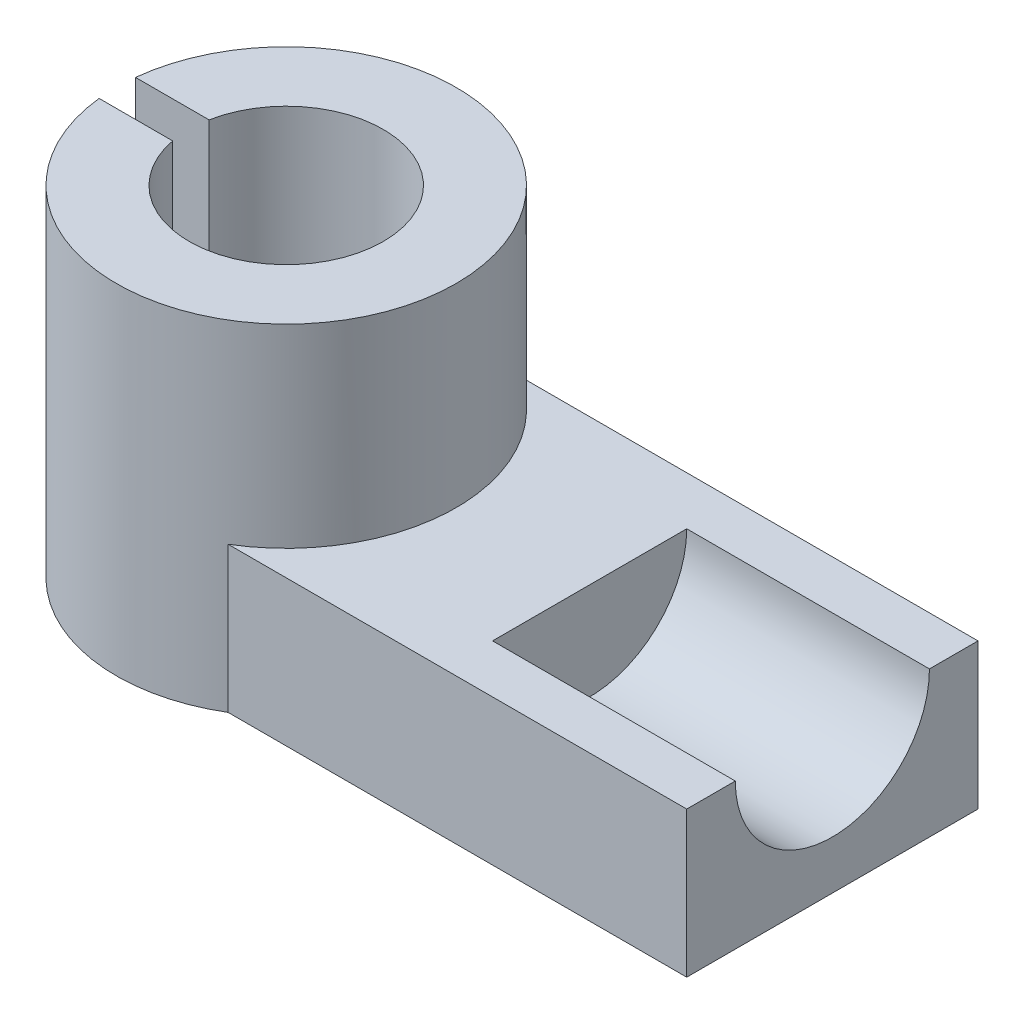
ISO-10303-21;
HEADER;
FILE_DESCRIPTION(('STEP AP214'),'2;1');
FILE_NAME('part.step','',(''),(''),'','','');
FILE_SCHEMA(('AUTOMOTIVE_DESIGN { 1 0 10303 214 1 1 1 1 }'));
ENDSEC;
DATA;
#1=APPLICATION_CONTEXT('core data for automotive mechanical design processes');
#2=APPLICATION_PROTOCOL_DEFINITION('international standard','automotive_design',2000,#1);
#3=PRODUCT_CONTEXT('',#1,'mechanical');
#4=PRODUCT('Part','Part','',(#3));
#5=PRODUCT_RELATED_PRODUCT_CATEGORY('part','',(#4));
#6=PRODUCT_DEFINITION_FORMATION('','',#4);
#7=PRODUCT_DEFINITION_CONTEXT('part definition',#1,'design');
#8=PRODUCT_DEFINITION('design','',#6,#7);
#9=PRODUCT_DEFINITION_SHAPE('','',#8);
#10=(LENGTH_UNIT() NAMED_UNIT(*) SI_UNIT(.MILLI.,.METRE.));
#11=(NAMED_UNIT(*) PLANE_ANGLE_UNIT() SI_UNIT($,.RADIAN.));
#12=(NAMED_UNIT(*) SI_UNIT($,.STERADIAN.) SOLID_ANGLE_UNIT());
#13=UNCERTAINTY_MEASURE_WITH_UNIT(LENGTH_MEASURE(1.E-05),#10,'distance_accuracy_value','');
#14=(GEOMETRIC_REPRESENTATION_CONTEXT(3) GLOBAL_UNCERTAINTY_ASSIGNED_CONTEXT((#13)) GLOBAL_UNIT_ASSIGNED_CONTEXT((#10,
#11,#12)) REPRESENTATION_CONTEXT('',''));
#15=CARTESIAN_POINT('',(0.,0.,0.));
#16=DIRECTION('',(0.,0.,1.));
#17=DIRECTION('',(1.,0.,0.));
#18=AXIS2_PLACEMENT_3D('',#15,#16,#17);
#19=CARTESIAN_POINT('',(0.,0.,0.));
#20=DIRECTION('',(0.,-1.,0.));
#21=DIRECTION('',(0.,0.,-1.));
#22=AXIS2_PLACEMENT_3D('',#19,#20,#21);
#23=PLANE('',#22);
#24=CARTESIAN_POINT('',(0.,0.,0.));
#25=DIRECTION('',(0.,1.,0.));
#26=DIRECTION('',(0.,0.,-1.));
#27=AXIS2_PLACEMENT_3D('',#24,#25,#26);
#28=CIRCLE('',#27,71.12);
#29=CARTESIAN_POINT('',(-70.7106074079413,0.,7.61999999999999));
#30=VERTEX_POINT('',#29);
#31=CARTESIAN_POINT('',(36.6324009587141,0.,60.96));
#32=VERTEX_POINT('',#31);
#33=EDGE_CURVE('E180',#30,#32,#28,.T.);
#34=ORIENTED_EDGE('',*,*,#33,.F.);
#35=DIRECTION('',(1.,0.,0.));
#36=VECTOR('',#35,1.);
#37=CARTESIAN_POINT('',(-39.9192334595744,0.,7.62));
#38=LINE('',#37,#36);
#39=CARTESIAN_POINT('',(-39.9192334595744,0.,7.62));
#40=VERTEX_POINT('',#39);
#41=EDGE_CURVE('E130',#30,#40,#38,.T.);
#42=ORIENTED_EDGE('',*,*,#41,.T.);
#43=CARTESIAN_POINT('',(0.,0.,0.));
#44=DIRECTION('',(0.,1.,0.));
#45=DIRECTION('',(0.,0.,-1.));
#46=AXIS2_PLACEMENT_3D('',#43,#44,#45);
#47=CIRCLE('',#46,40.64);
#48=CARTESIAN_POINT('',(-39.9192334595744,0.,-7.61999999999999));
#49=VERTEX_POINT('',#48);
#50=EDGE_CURVE('E117',#40,#49,#47,.T.);
#51=ORIENTED_EDGE('',*,*,#50,.T.);
#52=DIRECTION('',(-1.,0.,0.));
#53=VECTOR('',#52,1.);
#54=CARTESIAN_POINT('',(-39.9192334595744,0.,-7.61999999999999));
#55=LINE('',#54,#53);
#56=CARTESIAN_POINT('',(-70.7106074079413,0.,-7.61999999999995));
#57=VERTEX_POINT('',#56);
#58=EDGE_CURVE('E128',#49,#57,#55,.T.);
#59=ORIENTED_EDGE('',*,*,#58,.T.);
#60=CARTESIAN_POINT('',(36.632400958714,0.,-60.96));
#61=VERTEX_POINT('',#60);
#62=EDGE_CURVE('E176',#61,#57,#28,.T.);
#63=ORIENTED_EDGE('',*,*,#62,.F.);
#64=DIRECTION('',(-1.,0.,0.));
#65=VECTOR('',#64,1.);
#66=CARTESIAN_POINT('',(228.6,0.,-60.96));
#67=LINE('',#66,#65);
#68=CARTESIAN_POINT('',(228.6,0.,-60.96));
#69=VERTEX_POINT('',#68);
#70=EDGE_CURVE('E163',#69,#61,#67,.T.);
#71=ORIENTED_EDGE('',*,*,#70,.F.);
#72=DIRECTION('',(0.,0.,-1.));
#73=VECTOR('',#72,1.);
#74=CARTESIAN_POINT('',(228.6,0.,-60.96));
#75=LINE('',#74,#73);
#76=CARTESIAN_POINT('',(228.6,0.,60.96));
#77=VERTEX_POINT('',#76);
#78=EDGE_CURVE('E168',#77,#69,#75,.T.);
#79=ORIENTED_EDGE('',*,*,#78,.F.);
#80=DIRECTION('',(1.,0.,0.));
#81=VECTOR('',#80,1.);
#82=CARTESIAN_POINT('',(228.6,0.,60.96));
#83=LINE('',#82,#81);
#84=EDGE_CURVE('E185',#32,#77,#83,.T.);
#85=ORIENTED_EDGE('',*,*,#84,.F.);
#86=EDGE_LOOP('',(#34,#42,#51,#59,#63,#71,#79,#85));
#87=FACE_BOUND('',#86,.T.);
#88=ADVANCED_FACE('F39',(#87),#23,.T.);
#89=CARTESIAN_POINT('',(228.6,60.96,-60.96));
#90=DIRECTION('',(-1.,0.,0.));
#91=DIRECTION('',(0.,0.,1.));
#92=AXIS2_PLACEMENT_3D('',#89,#90,#91);
#93=PLANE('',#92);
#94=DIRECTION('',(0.,0.,-1.));
#95=VECTOR('',#94,1.);
#96=CARTESIAN_POINT('',(228.6,60.96,-60.96));
#97=LINE('',#96,#95);
#98=CARTESIAN_POINT('',(228.6,60.96,-40.64));
#99=VERTEX_POINT('',#98);
#100=CARTESIAN_POINT('',(228.6,60.96,-60.96));
#101=VERTEX_POINT('',#100);
#102=EDGE_CURVE('E171',#99,#101,#97,.T.);
#103=ORIENTED_EDGE('',*,*,#102,.F.);
#104=CARTESIAN_POINT('',(228.6,60.96,0.));
#105=DIRECTION('',(1.,0.,0.));
#106=DIRECTION('',(0.,0.,-1.));
#107=AXIS2_PLACEMENT_3D('',#104,#105,#106);
#108=CIRCLE('',#107,40.64);
#109=CARTESIAN_POINT('',(228.6,60.96,40.64));
#110=VERTEX_POINT('',#109);
#111=EDGE_CURVE('E148',#99,#110,#108,.F.);
#112=ORIENTED_EDGE('',*,*,#111,.T.);
#113=CARTESIAN_POINT('',(228.6,60.96,60.96));
#114=VERTEX_POINT('',#113);
#115=EDGE_CURVE('E175',#114,#110,#97,.T.);
#116=ORIENTED_EDGE('',*,*,#115,.F.);
#117=DIRECTION('',(0.,-1.,0.));
#118=VECTOR('',#117,1.);
#119=CARTESIAN_POINT('',(228.6,60.96,60.96));
#120=LINE('',#119,#118);
#121=EDGE_CURVE('E186',#114,#77,#120,.T.);
#122=ORIENTED_EDGE('',*,*,#121,.T.);
#123=ORIENTED_EDGE('',*,*,#78,.T.);
#124=DIRECTION('',(0.,-1.,0.));
#125=VECTOR('',#124,1.);
#126=CARTESIAN_POINT('',(228.6,60.96,-60.96));
#127=LINE('',#126,#125);
#128=EDGE_CURVE('E178',#101,#69,#127,.T.);
#129=ORIENTED_EDGE('',*,*,#128,.F.);
#130=EDGE_LOOP('',(#103,#112,#116,#122,#123,#129));
#131=FACE_BOUND('',#130,.T.);
#132=ADVANCED_FACE('F205',(#131),#93,.F.);
#133=CARTESIAN_POINT('',(0.,60.96,0.));
#134=DIRECTION('',(0.,-1.,0.));
#135=DIRECTION('',(0.,0.,-1.));
#136=AXIS2_PLACEMENT_3D('',#133,#134,#135);
#137=PLANE('',#136);
#138=DIRECTION('',(0.,0.,1.));
#139=VECTOR('',#138,1.);
#140=CARTESIAN_POINT('',(127.,60.96,0.));
#141=LINE('',#140,#139);
#142=CARTESIAN_POINT('',(127.,60.96,-40.64));
#143=VERTEX_POINT('',#142);
#144=CARTESIAN_POINT('',(127.,60.96,40.64));
#145=VERTEX_POINT('',#144);
#146=EDGE_CURVE('E151',#143,#145,#141,.T.);
#147=ORIENTED_EDGE('',*,*,#146,.F.);
#148=DIRECTION('',(1.,0.,0.));
#149=VECTOR('',#148,1.);
#150=CARTESIAN_POINT('',(127.,60.96,-40.64));
#151=LINE('',#150,#149);
#152=EDGE_CURVE('E153',#143,#99,#151,.T.);
#153=ORIENTED_EDGE('',*,*,#152,.T.);
#154=ORIENTED_EDGE('',*,*,#102,.T.);
#155=DIRECTION('',(-1.,0.,0.));
#156=VECTOR('',#155,1.);
#157=CARTESIAN_POINT('',(228.6,60.96,-60.96));
#158=LINE('',#157,#156);
#159=CARTESIAN_POINT('',(36.632400958714,60.96,-60.96));
#160=VERTEX_POINT('',#159);
#161=EDGE_CURVE('E170',#101,#160,#158,.T.);
#162=ORIENTED_EDGE('',*,*,#161,.T.);
#163=CARTESIAN_POINT('',(0.,60.96,0.));
#164=DIRECTION('',(0.,1.,0.));
#165=DIRECTION('',(0.,0.,1.));
#166=AXIS2_PLACEMENT_3D('',#163,#164,#165);
#167=CIRCLE('',#166,71.12);
#168=CARTESIAN_POINT('',(36.6324009587141,60.96,60.96));
#169=VERTEX_POINT('',#168);
#170=EDGE_CURVE('E158',#169,#160,#167,.T.);
#171=ORIENTED_EDGE('',*,*,#170,.F.);
#172=DIRECTION('',(1.,0.,0.));
#173=VECTOR('',#172,1.);
#174=CARTESIAN_POINT('',(228.6,60.96,60.96));
#175=LINE('',#174,#173);
#176=EDGE_CURVE('E166',#169,#114,#175,.T.);
#177=ORIENTED_EDGE('',*,*,#176,.T.);
#178=ORIENTED_EDGE('',*,*,#115,.T.);
#179=DIRECTION('',(1.,0.,0.));
#180=VECTOR('',#179,1.);
#181=CARTESIAN_POINT('',(127.,60.96,40.64));
#182=LINE('',#181,#180);
#183=EDGE_CURVE('E156',#145,#110,#182,.T.);
#184=ORIENTED_EDGE('',*,*,#183,.F.);
#185=EDGE_LOOP('',(#147,#153,#154,#162,#171,#177,#178,#184));
#186=FACE_BOUND('',#185,.T.);
#187=ADVANCED_FACE('F207',(#186),#137,.F.);
#188=CARTESIAN_POINT('',(228.6,60.96,-60.96));
#189=DIRECTION('',(0.,0.,1.));
#190=DIRECTION('',(1.,0.,0.));
#191=AXIS2_PLACEMENT_3D('',#188,#189,#190);
#192=PLANE('',#191);
#193=ORIENTED_EDGE('',*,*,#70,.T.);
#194=DIRECTION('',(0.,-1.,0.));
#195=VECTOR('',#194,1.);
#196=CARTESIAN_POINT('',(36.632400958714,60.96,-60.96));
#197=LINE('',#196,#195);
#198=EDGE_CURVE('E11',#160,#61,#197,.T.);
#199=ORIENTED_EDGE('',*,*,#198,.F.);
#200=ORIENTED_EDGE('',*,*,#161,.F.);
#201=ORIENTED_EDGE('',*,*,#128,.T.);
#202=EDGE_LOOP('',(#193,#199,#200,#201));
#203=FACE_BOUND('',#202,.T.);
#204=ADVANCED_FACE('F41',(#203),#192,.F.);
#205=CARTESIAN_POINT('',(0.,60.96,0.));
#206=DIRECTION('',(0.,-1.,0.));
#207=DIRECTION('',(0.,0.,-1.));
#208=AXIS2_PLACEMENT_3D('',#205,#206,#207);
#209=CYLINDRICAL_SURFACE('',#208,71.12);
#210=ORIENTED_EDGE('',*,*,#62,.T.);
#211=DIRECTION('',(0.,1.,0.));
#212=VECTOR('',#211,1.);
#213=CARTESIAN_POINT('',(-70.7106074079413,0.,-7.61999999999995));
#214=LINE('',#213,#212);
#215=CARTESIAN_POINT('',(-70.7106074079413,142.24,-7.61999999999995));
#216=VERTEX_POINT('',#215);
#217=EDGE_CURVE('E127',#57,#216,#214,.T.);
#218=ORIENTED_EDGE('',*,*,#217,.T.);
#219=CARTESIAN_POINT('',(0.,142.24,0.));
#220=DIRECTION('',(0.,1.,0.));
#221=DIRECTION('',(0.,0.,1.));
#222=AXIS2_PLACEMENT_3D('',#219,#220,#221);
#223=CIRCLE('',#222,71.12);
#224=CARTESIAN_POINT('',(-70.7106074079413,142.24,7.61999999999999));
#225=VERTEX_POINT('',#224);
#226=EDGE_CURVE('E161',#225,#216,#223,.T.);
#227=ORIENTED_EDGE('',*,*,#226,.F.);
#228=DIRECTION('',(0.,1.,0.));
#229=VECTOR('',#228,1.);
#230=CARTESIAN_POINT('',(-70.7106074079413,0.,7.61999999999999));
#231=LINE('',#230,#229);
#232=EDGE_CURVE('E150',#30,#225,#231,.T.);
#233=ORIENTED_EDGE('',*,*,#232,.F.);
#234=ORIENTED_EDGE('',*,*,#33,.T.);
#235=DIRECTION('',(0.,-1.,0.));
#236=VECTOR('',#235,1.);
#237=CARTESIAN_POINT('',(36.6324009587141,60.96,60.96));
#238=LINE('',#237,#236);
#239=EDGE_CURVE('E50',#169,#32,#238,.T.);
#240=ORIENTED_EDGE('',*,*,#239,.F.);
#241=ORIENTED_EDGE('',*,*,#170,.T.);
#242=ORIENTED_EDGE('',*,*,#198,.T.);
#243=EDGE_LOOP('',(#210,#218,#227,#233,#234,#240,#241,#242));
#244=FACE_BOUND('',#243,.T.);
#245=ADVANCED_FACE('F231',(#244),#209,.T.);
#246=CARTESIAN_POINT('',(228.6,60.96,60.96));
#247=DIRECTION('',(0.,0.,-1.));
#248=DIRECTION('',(-1.,0.,0.));
#249=AXIS2_PLACEMENT_3D('',#246,#247,#248);
#250=PLANE('',#249);
#251=ORIENTED_EDGE('',*,*,#84,.T.);
#252=ORIENTED_EDGE('',*,*,#121,.F.);
#253=ORIENTED_EDGE('',*,*,#176,.F.);
#254=ORIENTED_EDGE('',*,*,#239,.T.);
#255=EDGE_LOOP('',(#251,#252,#253,#254));
#256=FACE_BOUND('',#255,.T.);
#257=ADVANCED_FACE('F192',(#256),#250,.F.);
#258=CARTESIAN_POINT('',(0.,142.24,0.));
#259=DIRECTION('',(0.,1.,0.));
#260=DIRECTION('',(0.,0.,1.));
#261=AXIS2_PLACEMENT_3D('',#258,#259,#260);
#262=PLANE('',#261);
#263=DIRECTION('',(-1.,0.,0.));
#264=VECTOR('',#263,1.);
#265=CARTESIAN_POINT('',(-39.9192334595744,142.24,-7.61999999999999));
#266=LINE('',#265,#264);
#267=CARTESIAN_POINT('',(-39.9192334595744,142.24,-7.61999999999999));
#268=VERTEX_POINT('',#267);
#269=EDGE_CURVE('E137',#268,#216,#266,.T.);
#270=ORIENTED_EDGE('',*,*,#269,.F.);
#271=CARTESIAN_POINT('',(0.,142.24,0.));
#272=DIRECTION('',(0.,1.,0.));
#273=DIRECTION('',(0.,0.,-1.));
#274=AXIS2_PLACEMENT_3D('',#271,#272,#273);
#275=CIRCLE('',#274,40.64);
#276=CARTESIAN_POINT('',(-39.9192334595744,142.24,7.62));
#277=VERTEX_POINT('',#276);
#278=EDGE_CURVE('E122',#277,#268,#275,.T.);
#279=ORIENTED_EDGE('',*,*,#278,.F.);
#280=DIRECTION('',(1.,0.,0.));
#281=VECTOR('',#280,1.);
#282=CARTESIAN_POINT('',(-39.9192334595744,142.24,7.62));
#283=LINE('',#282,#281);
#284=EDGE_CURVE('E53',#225,#277,#283,.T.);
#285=ORIENTED_EDGE('',*,*,#284,.F.);
#286=ORIENTED_EDGE('',*,*,#226,.T.);
#287=EDGE_LOOP('',(#270,#279,#285,#286));
#288=FACE_BOUND('',#287,.T.);
#289=ADVANCED_FACE('F224',(#288),#262,.T.);
#290=CARTESIAN_POINT('',(127.,60.96,0.));
#291=DIRECTION('',(1.,0.,0.));
#292=DIRECTION('',(0.,0.,-1.));
#293=AXIS2_PLACEMENT_3D('',#290,#291,#292);
#294=CYLINDRICAL_SURFACE('',#293,40.64);
#295=ORIENTED_EDGE('',*,*,#111,.F.);
#296=ORIENTED_EDGE('',*,*,#152,.F.);
#297=CARTESIAN_POINT('',(127.,60.96,0.));
#298=DIRECTION('',(1.,0.,0.));
#299=DIRECTION('',(0.,0.,-1.));
#300=AXIS2_PLACEMENT_3D('',#297,#298,#299);
#301=CIRCLE('',#300,40.64);
#302=EDGE_CURVE('E64',#143,#145,#301,.F.);
#303=ORIENTED_EDGE('',*,*,#302,.T.);
#304=ORIENTED_EDGE('',*,*,#183,.T.);
#305=EDGE_LOOP('',(#295,#296,#303,#304));
#306=FACE_BOUND('',#305,.T.);
#307=ADVANCED_FACE('F215',(#306),#294,.F.);
#308=CARTESIAN_POINT('',(127.,0.,0.));
#309=DIRECTION('',(1.,0.,0.));
#310=DIRECTION('',(0.,0.,-1.));
#311=AXIS2_PLACEMENT_3D('',#308,#309,#310);
#312=PLANE('',#311);
#313=ORIENTED_EDGE('',*,*,#302,.F.);
#314=ORIENTED_EDGE('',*,*,#146,.T.);
#315=EDGE_LOOP('',(#313,#314));
#316=FACE_BOUND('',#315,.T.);
#317=ADVANCED_FACE('F213',(#316),#312,.T.);
#318=CARTESIAN_POINT('',(0.,0.,0.));
#319=DIRECTION('',(0.,1.,0.));
#320=DIRECTION('',(0.,0.,1.));
#321=AXIS2_PLACEMENT_3D('',#318,#319,#320);
#322=CYLINDRICAL_SURFACE('',#321,40.64);
#323=ORIENTED_EDGE('',*,*,#278,.T.);
#324=DIRECTION('',(0.,1.,0.));
#325=VECTOR('',#324,1.);
#326=CARTESIAN_POINT('',(-39.9192334595744,0.,-7.61999999999999));
#327=LINE('',#326,#325);
#328=EDGE_CURVE('E119',#49,#268,#327,.T.);
#329=ORIENTED_EDGE('',*,*,#328,.F.);
#330=ORIENTED_EDGE('',*,*,#50,.F.);
#331=DIRECTION('',(0.,1.,0.));
#332=VECTOR('',#331,1.);
#333=CARTESIAN_POINT('',(-39.9192334595744,0.,7.62));
#334=LINE('',#333,#332);
#335=EDGE_CURVE('E145',#40,#277,#334,.T.);
#336=ORIENTED_EDGE('',*,*,#335,.T.);
#337=EDGE_LOOP('',(#323,#329,#330,#336));
#338=FACE_BOUND('',#337,.T.);
#339=ADVANCED_FACE('F120',(#338),#322,.F.);
#340=CARTESIAN_POINT('',(-39.9192334595744,0.,7.62));
#341=DIRECTION('',(0.,0.,1.));
#342=DIRECTION('',(1.,0.,0.));
#343=AXIS2_PLACEMENT_3D('',#340,#341,#342);
#344=PLANE('',#343);
#345=ORIENTED_EDGE('',*,*,#284,.T.);
#346=ORIENTED_EDGE('',*,*,#335,.F.);
#347=ORIENTED_EDGE('',*,*,#41,.F.);
#348=ORIENTED_EDGE('',*,*,#232,.T.);
#349=EDGE_LOOP('',(#345,#346,#347,#348));
#350=FACE_BOUND('',#349,.T.);
#351=ADVANCED_FACE('F222',(#350),#344,.F.);
#352=CARTESIAN_POINT('',(-39.9192334595744,0.,-7.61999999999999));
#353=DIRECTION('',(0.,0.,-1.));
#354=DIRECTION('',(-1.,0.,0.));
#355=AXIS2_PLACEMENT_3D('',#352,#353,#354);
#356=PLANE('',#355);
#357=ORIENTED_EDGE('',*,*,#269,.T.);
#358=ORIENTED_EDGE('',*,*,#217,.F.);
#359=ORIENTED_EDGE('',*,*,#58,.F.);
#360=ORIENTED_EDGE('',*,*,#328,.T.);
#361=EDGE_LOOP('',(#357,#358,#359,#360));
#362=FACE_BOUND('',#361,.T.);
#363=ADVANCED_FACE('F134',(#362),#356,.F.);
#364=CLOSED_SHELL('',(#88,#132,#187,#204,#245,#257,#289,#307,#317,#339,#351,#363));
#365=MANIFOLD_SOLID_BREP('B2',#364);
#366=ADVANCED_BREP_SHAPE_REPRESENTATION('',(#18,#365),#14);
#367=SHAPE_DEFINITION_REPRESENTATION(#9,#366);
ENDSEC;
END-ISO-10303-21;
